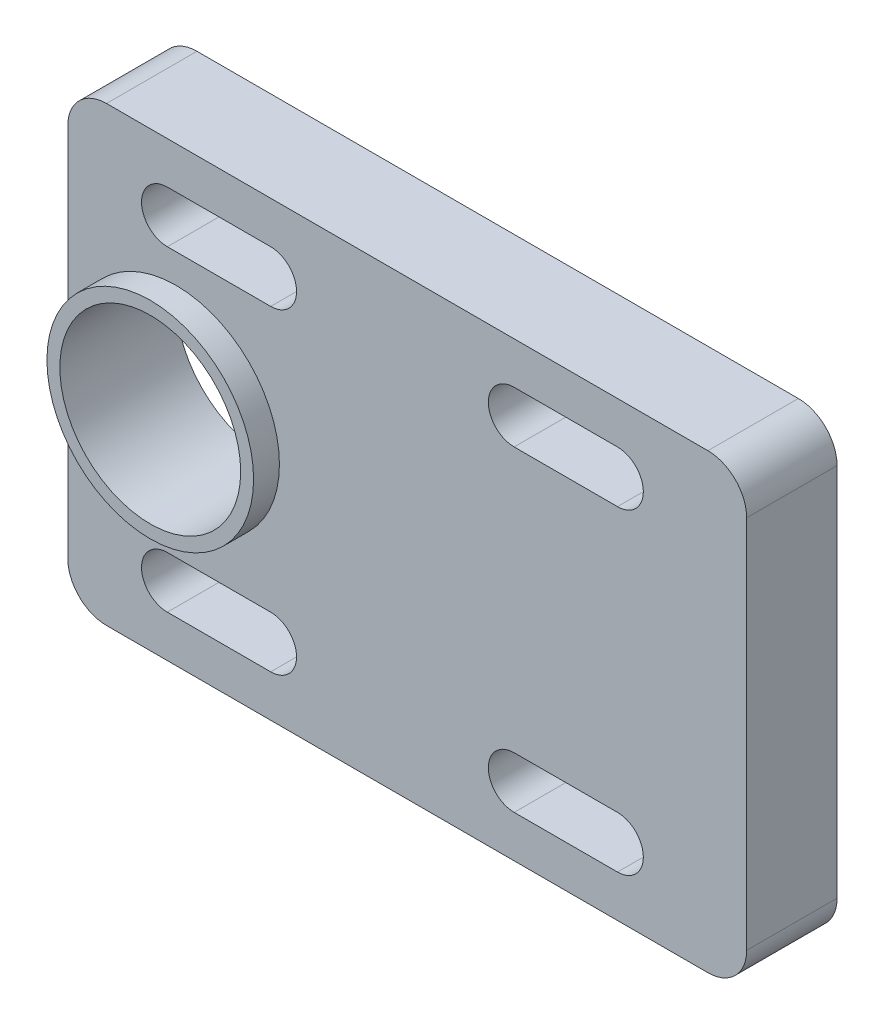
ISO-10303-21;
HEADER;
FILE_DESCRIPTION(('STEP AP214'),'2;1');
FILE_NAME('part.step','',(''),(''),'','','');
FILE_SCHEMA(('AUTOMOTIVE_DESIGN { 1 0 10303 214 1 1 1 1 }'));
ENDSEC;
DATA;
#1=APPLICATION_CONTEXT('core data for automotive mechanical design processes');
#2=APPLICATION_PROTOCOL_DEFINITION('international standard','automotive_design',2000,#1);
#3=PRODUCT_CONTEXT('',#1,'mechanical');
#4=PRODUCT('Part','Part','',(#3));
#5=PRODUCT_RELATED_PRODUCT_CATEGORY('part','',(#4));
#6=PRODUCT_DEFINITION_FORMATION('','',#4);
#7=PRODUCT_DEFINITION_CONTEXT('part definition',#1,'design');
#8=PRODUCT_DEFINITION('design','',#6,#7);
#9=PRODUCT_DEFINITION_SHAPE('','',#8);
#10=(LENGTH_UNIT() NAMED_UNIT(*) SI_UNIT(.MILLI.,.METRE.));
#11=(NAMED_UNIT(*) PLANE_ANGLE_UNIT() SI_UNIT($,.RADIAN.));
#12=(NAMED_UNIT(*) SI_UNIT($,.STERADIAN.) SOLID_ANGLE_UNIT());
#13=UNCERTAINTY_MEASURE_WITH_UNIT(LENGTH_MEASURE(1.E-05),#10,'distance_accuracy_value','');
#14=(GEOMETRIC_REPRESENTATION_CONTEXT(3) GLOBAL_UNCERTAINTY_ASSIGNED_CONTEXT((#13)) GLOBAL_UNIT_ASSIGNED_CONTEXT((#10,
#11,#12)) REPRESENTATION_CONTEXT('',''));
#15=CARTESIAN_POINT('',(0.,0.,0.));
#16=DIRECTION('',(0.,0.,1.));
#17=DIRECTION('',(1.,0.,0.));
#18=AXIS2_PLACEMENT_3D('',#15,#16,#17);
#19=CARTESIAN_POINT('',(-159.52130484111,-12.2499999999999,9.));
#20=DIRECTION('',(0.,0.,-1.));
#21=DIRECTION('',(-1.,0.,0.));
#22=AXIS2_PLACEMENT_3D('',#19,#20,#21);
#23=CYLINDRICAL_SURFACE('',#22,1.99999999999997);
#24=DIRECTION('',(0.,0.,-1.));
#25=VECTOR('',#24,1.);
#26=CARTESIAN_POINT('',(-159.52130484111,-10.2500000000001,9.));
#27=LINE('',#26,#25);
#28=CARTESIAN_POINT('',(-159.52130484111,-10.2500000000001,7.));
#29=VERTEX_POINT('',#28);
#30=CARTESIAN_POINT('',(-159.52130484111,-10.2500000000001,0.));
#31=VERTEX_POINT('',#30);
#32=EDGE_CURVE('E11',#29,#31,#27,.T.);
#33=ORIENTED_EDGE('',*,*,#32,.F.);
#34=CARTESIAN_POINT('',(-159.52130484111,-12.2499999999999,7.));
#35=DIRECTION('',(0.,0.,1.));
#36=DIRECTION('',(1.,0.,0.));
#37=AXIS2_PLACEMENT_3D('',#34,#35,#36);
#38=CIRCLE('',#37,1.99999999999997);
#39=CARTESIAN_POINT('',(-159.52130484111,-14.2500000000001,7.));
#40=VERTEX_POINT('',#39);
#41=EDGE_CURVE('E414',#40,#29,#38,.F.);
#42=ORIENTED_EDGE('',*,*,#41,.F.);
#43=DIRECTION('',(0.,0.,-1.));
#44=VECTOR('',#43,1.);
#45=CARTESIAN_POINT('',(-159.52130484111,-14.2500000000001,9.));
#46=LINE('',#45,#44);
#47=CARTESIAN_POINT('',(-159.52130484111,-14.2500000000001,0.));
#48=VERTEX_POINT('',#47);
#49=EDGE_CURVE('E306',#40,#48,#46,.T.);
#50=ORIENTED_EDGE('',*,*,#49,.T.);
#51=CARTESIAN_POINT('',(-159.52130484111,-12.2499999999999,0.));
#52=DIRECTION('',(0.,0.,1.));
#53=DIRECTION('',(1.,0.,0.));
#54=AXIS2_PLACEMENT_3D('',#51,#52,#53);
#55=CIRCLE('',#54,1.99999999999997);
#56=EDGE_CURVE('E338',#31,#48,#55,.T.);
#57=ORIENTED_EDGE('',*,*,#56,.F.);
#58=EDGE_LOOP('',(#33,#42,#50,#57));
#59=FACE_BOUND('',#58,.T.);
#60=ADVANCED_FACE('F39',(#59),#23,.F.);
#61=CARTESIAN_POINT('',(0.,-10.2500000000001,9.));
#62=DIRECTION('',(0.,-1.,0.));
#63=DIRECTION('',(1.,0.,0.));
#64=AXIS2_PLACEMENT_3D('',#61,#62,#63);
#65=PLANE('',#64);
#66=DIRECTION('',(0.,0.,-1.));
#67=VECTOR('',#66,1.);
#68=CARTESIAN_POINT('',(-151.52130484111,-10.2500000000001,9.));
#69=LINE('',#68,#67);
#70=CARTESIAN_POINT('',(-151.52130484111,-10.2500000000001,7.));
#71=VERTEX_POINT('',#70);
#72=CARTESIAN_POINT('',(-151.52130484111,-10.2500000000001,0.));
#73=VERTEX_POINT('',#72);
#74=EDGE_CURVE('E48',#71,#73,#69,.T.);
#75=ORIENTED_EDGE('',*,*,#74,.F.);
#76=DIRECTION('',(1.,0.,0.));
#77=VECTOR('',#76,1.);
#78=CARTESIAN_POINT('',(0.,-10.2500000000001,7.));
#79=LINE('',#78,#77);
#80=EDGE_CURVE('E412',#29,#71,#79,.T.);
#81=ORIENTED_EDGE('',*,*,#80,.F.);
#82=ORIENTED_EDGE('',*,*,#32,.T.);
#83=DIRECTION('',(-1.,0.,0.));
#84=VECTOR('',#83,1.);
#85=CARTESIAN_POINT('',(0.,-10.2500000000001,0.));
#86=LINE('',#85,#84);
#87=EDGE_CURVE('E333',#73,#31,#86,.T.);
#88=ORIENTED_EDGE('',*,*,#87,.F.);
#89=EDGE_LOOP('',(#75,#81,#82,#88));
#90=FACE_BOUND('',#89,.T.);
#91=ADVANCED_FACE('F334',(#90),#65,.T.);
#92=CARTESIAN_POINT('',(-151.52130484111,-12.2500000000001,9.));
#93=DIRECTION('',(0.,0.,-1.));
#94=DIRECTION('',(-1.,0.,0.));
#95=AXIS2_PLACEMENT_3D('',#92,#93,#94);
#96=CYLINDRICAL_SURFACE('',#95,1.99999999999997);
#97=DIRECTION('',(0.,0.,-1.));
#98=VECTOR('',#97,1.);
#99=CARTESIAN_POINT('',(-151.52130484111,-14.2500000000001,9.));
#100=LINE('',#99,#98);
#101=CARTESIAN_POINT('',(-151.52130484111,-14.2500000000001,7.));
#102=VERTEX_POINT('',#101);
#103=CARTESIAN_POINT('',(-151.52130484111,-14.2500000000001,0.));
#104=VERTEX_POINT('',#103);
#105=EDGE_CURVE('E310',#102,#104,#100,.T.);
#106=ORIENTED_EDGE('',*,*,#105,.F.);
#107=CARTESIAN_POINT('',(-151.52130484111,-12.2500000000001,7.));
#108=DIRECTION('',(0.,0.,1.));
#109=DIRECTION('',(1.,0.,0.));
#110=AXIS2_PLACEMENT_3D('',#107,#108,#109);
#111=CIRCLE('',#110,1.99999999999997);
#112=EDGE_CURVE('E329',#71,#102,#111,.F.);
#113=ORIENTED_EDGE('',*,*,#112,.F.);
#114=ORIENTED_EDGE('',*,*,#74,.T.);
#115=CARTESIAN_POINT('',(-151.52130484111,-12.2500000000001,0.));
#116=DIRECTION('',(0.,0.,1.));
#117=DIRECTION('',(1.,0.,0.));
#118=AXIS2_PLACEMENT_3D('',#115,#116,#117);
#119=CIRCLE('',#118,1.99999999999997);
#120=EDGE_CURVE('E328',#104,#73,#119,.T.);
#121=ORIENTED_EDGE('',*,*,#120,.F.);
#122=EDGE_LOOP('',(#106,#113,#114,#121));
#123=FACE_BOUND('',#122,.T.);
#124=ADVANCED_FACE('F326',(#123),#96,.F.);
#125=CARTESIAN_POINT('',(-159.52130484111,12.2499999999999,9.));
#126=DIRECTION('',(0.,0.,-1.));
#127=DIRECTION('',(-1.,0.,0.));
#128=AXIS2_PLACEMENT_3D('',#125,#126,#127);
#129=CYLINDRICAL_SURFACE('',#128,1.99999999999997);
#130=DIRECTION('',(0.,0.,-1.));
#131=VECTOR('',#130,1.);
#132=CARTESIAN_POINT('',(-159.52130484111,14.25,9.));
#133=LINE('',#132,#131);
#134=CARTESIAN_POINT('',(-159.52130484111,14.25,7.));
#135=VERTEX_POINT('',#134);
#136=CARTESIAN_POINT('',(-159.52130484111,14.25,0.));
#137=VERTEX_POINT('',#136);
#138=EDGE_CURVE('E273',#135,#137,#133,.T.);
#139=ORIENTED_EDGE('',*,*,#138,.F.);
#140=CARTESIAN_POINT('',(-159.52130484111,12.2499999999999,7.));
#141=DIRECTION('',(0.,0.,1.));
#142=DIRECTION('',(1.,0.,0.));
#143=AXIS2_PLACEMENT_3D('',#140,#141,#142);
#144=CIRCLE('',#143,1.99999999999997);
#145=CARTESIAN_POINT('',(-159.52130484111,10.2500000000001,7.));
#146=VERTEX_POINT('',#145);
#147=EDGE_CURVE('E407',#146,#135,#144,.F.);
#148=ORIENTED_EDGE('',*,*,#147,.F.);
#149=DIRECTION('',(0.,0.,-1.));
#150=VECTOR('',#149,1.);
#151=CARTESIAN_POINT('',(-159.52130484111,10.2500000000001,9.));
#152=LINE('',#151,#150);
#153=CARTESIAN_POINT('',(-159.52130484111,10.2500000000001,0.));
#154=VERTEX_POINT('',#153);
#155=EDGE_CURVE('E288',#146,#154,#152,.T.);
#156=ORIENTED_EDGE('',*,*,#155,.T.);
#157=CARTESIAN_POINT('',(-159.52130484111,12.2499999999999,0.));
#158=DIRECTION('',(0.,0.,1.));
#159=DIRECTION('',(1.,0.,0.));
#160=AXIS2_PLACEMENT_3D('',#157,#158,#159);
#161=CIRCLE('',#160,1.99999999999997);
#162=EDGE_CURVE('E352',#137,#154,#161,.T.);
#163=ORIENTED_EDGE('',*,*,#162,.F.);
#164=EDGE_LOOP('',(#139,#148,#156,#163));
#165=FACE_BOUND('',#164,.T.);
#166=ADVANCED_FACE('F476',(#165),#129,.F.);
#167=CARTESIAN_POINT('',(0.,14.25,9.));
#168=DIRECTION('',(0.,-1.,0.));
#169=DIRECTION('',(0.,0.,-1.));
#170=AXIS2_PLACEMENT_3D('',#167,#168,#169);
#171=PLANE('',#170);
#172=DIRECTION('',(0.,0.,-1.));
#173=VECTOR('',#172,1.);
#174=CARTESIAN_POINT('',(-151.52130484111,14.25,9.));
#175=LINE('',#174,#173);
#176=CARTESIAN_POINT('',(-151.52130484111,14.25,7.));
#177=VERTEX_POINT('',#176);
#178=CARTESIAN_POINT('',(-151.52130484111,14.25,0.));
#179=VERTEX_POINT('',#178);
#180=EDGE_CURVE('E299',#177,#179,#175,.T.);
#181=ORIENTED_EDGE('',*,*,#180,.F.);
#182=DIRECTION('',(1.,0.,0.));
#183=VECTOR('',#182,1.);
#184=CARTESIAN_POINT('',(0.,14.25,7.));
#185=LINE('',#184,#183);
#186=EDGE_CURVE('E405',#135,#177,#185,.T.);
#187=ORIENTED_EDGE('',*,*,#186,.F.);
#188=ORIENTED_EDGE('',*,*,#138,.T.);
#189=DIRECTION('',(-1.,0.,0.));
#190=VECTOR('',#189,1.);
#191=CARTESIAN_POINT('',(0.,14.25,0.));
#192=LINE('',#191,#190);
#193=EDGE_CURVE('E349',#179,#137,#192,.T.);
#194=ORIENTED_EDGE('',*,*,#193,.F.);
#195=EDGE_LOOP('',(#181,#187,#188,#194));
#196=FACE_BOUND('',#195,.T.);
#197=ADVANCED_FACE('F473',(#196),#171,.T.);
#198=CARTESIAN_POINT('',(-151.52130484111,12.25,9.));
#199=DIRECTION('',(0.,0.,-1.));
#200=DIRECTION('',(-1.,0.,0.));
#201=AXIS2_PLACEMENT_3D('',#198,#199,#200);
#202=CYLINDRICAL_SURFACE('',#201,1.99999999999997);
#203=DIRECTION('',(0.,0.,-1.));
#204=VECTOR('',#203,1.);
#205=CARTESIAN_POINT('',(-151.52130484111,10.2500000000001,9.));
#206=LINE('',#205,#204);
#207=CARTESIAN_POINT('',(-151.52130484111,10.2500000000001,7.));
#208=VERTEX_POINT('',#207);
#209=CARTESIAN_POINT('',(-151.52130484111,10.2500000000001,0.));
#210=VERTEX_POINT('',#209);
#211=EDGE_CURVE('E292',#208,#210,#206,.T.);
#212=ORIENTED_EDGE('',*,*,#211,.F.);
#213=CARTESIAN_POINT('',(-151.52130484111,12.25,7.));
#214=DIRECTION('',(0.,0.,1.));
#215=DIRECTION('',(1.,0.,0.));
#216=AXIS2_PLACEMENT_3D('',#213,#214,#215);
#217=CIRCLE('',#216,1.99999999999997);
#218=EDGE_CURVE('E56',#177,#208,#217,.F.);
#219=ORIENTED_EDGE('',*,*,#218,.F.);
#220=ORIENTED_EDGE('',*,*,#180,.T.);
#221=CARTESIAN_POINT('',(-151.52130484111,12.25,0.));
#222=DIRECTION('',(0.,0.,1.));
#223=DIRECTION('',(1.,0.,0.));
#224=AXIS2_PLACEMENT_3D('',#221,#222,#223);
#225=CIRCLE('',#224,1.99999999999997);
#226=EDGE_CURVE('E346',#210,#179,#225,.T.);
#227=ORIENTED_EDGE('',*,*,#226,.F.);
#228=EDGE_LOOP('',(#212,#219,#220,#227));
#229=FACE_BOUND('',#228,.T.);
#230=ADVANCED_FACE('F469',(#229),#202,.F.);
#231=CARTESIAN_POINT('',(-144.52130484111,14.5,9.));
#232=DIRECTION('',(0.,0.,-1.));
#233=DIRECTION('',(-1.,0.,0.));
#234=AXIS2_PLACEMENT_3D('',#231,#232,#233);
#235=CYLINDRICAL_SURFACE('',#234,2.99999999999999);
#236=DIRECTION('',(0.,0.,-1.));
#237=VECTOR('',#236,1.);
#238=CARTESIAN_POINT('',(-144.52130484111,17.5,9.));
#239=LINE('',#238,#237);
#240=CARTESIAN_POINT('',(-144.52130484111,17.5,7.));
#241=VERTEX_POINT('',#240);
#242=CARTESIAN_POINT('',(-144.52130484111,17.5,0.));
#243=VERTEX_POINT('',#242);
#244=EDGE_CURVE('E252',#241,#243,#239,.T.);
#245=ORIENTED_EDGE('',*,*,#244,.F.);
#246=CARTESIAN_POINT('',(-144.52130484111,14.5,7.));
#247=DIRECTION('',(0.,0.,1.));
#248=DIRECTION('',(1.,0.,0.));
#249=AXIS2_PLACEMENT_3D('',#246,#247,#248);
#250=CIRCLE('',#249,2.99999999999999);
#251=CARTESIAN_POINT('',(-141.52130484111,14.5,7.));
#252=VERTEX_POINT('',#251);
#253=EDGE_CURVE('E429',#252,#241,#250,.T.);
#254=ORIENTED_EDGE('',*,*,#253,.F.);
#255=DIRECTION('',(0.,0.,-1.));
#256=VECTOR('',#255,1.);
#257=CARTESIAN_POINT('',(-141.52130484111,14.5,9.));
#258=LINE('',#257,#256);
#259=CARTESIAN_POINT('',(-141.52130484111,14.5,0.));
#260=VERTEX_POINT('',#259);
#261=EDGE_CURVE('E259',#252,#260,#258,.T.);
#262=ORIENTED_EDGE('',*,*,#261,.T.);
#263=CARTESIAN_POINT('',(-144.52130484111,14.5,0.));
#264=DIRECTION('',(0.,0.,1.));
#265=DIRECTION('',(1.,0.,0.));
#266=AXIS2_PLACEMENT_3D('',#263,#264,#265);
#267=CIRCLE('',#266,2.99999999999999);
#268=EDGE_CURVE('E375',#243,#260,#267,.F.);
#269=ORIENTED_EDGE('',*,*,#268,.F.);
#270=EDGE_LOOP('',(#245,#254,#262,#269));
#271=FACE_BOUND('',#270,.T.);
#272=ADVANCED_FACE('F472',(#271),#235,.T.);
#273=CARTESIAN_POINT('',(0.,17.5,9.));
#274=DIRECTION('',(0.,1.,0.));
#275=DIRECTION('',(-1.,0.,0.));
#276=AXIS2_PLACEMENT_3D('',#273,#274,#275);
#277=PLANE('',#276);
#278=DIRECTION('',(0.,0.,-1.));
#279=VECTOR('',#278,1.);
#280=CARTESIAN_POINT('',(-191.078194944525,17.5,9.));
#281=LINE('',#280,#279);
#282=CARTESIAN_POINT('',(-191.078194944525,17.5,7.));
#283=VERTEX_POINT('',#282);
#284=CARTESIAN_POINT('',(-191.078194944525,17.5,0.));
#285=VERTEX_POINT('',#284);
#286=EDGE_CURVE('E282',#283,#285,#281,.T.);
#287=ORIENTED_EDGE('',*,*,#286,.F.);
#288=DIRECTION('',(-1.,0.,0.));
#289=VECTOR('',#288,1.);
#290=CARTESIAN_POINT('',(0.,17.5,7.));
#291=LINE('',#290,#289);
#292=EDGE_CURVE('E427',#241,#283,#291,.T.);
#293=ORIENTED_EDGE('',*,*,#292,.F.);
#294=ORIENTED_EDGE('',*,*,#244,.T.);
#295=DIRECTION('',(1.,0.,0.));
#296=VECTOR('',#295,1.);
#297=CARTESIAN_POINT('',(0.,17.5,0.));
#298=LINE('',#297,#296);
#299=EDGE_CURVE('E372',#285,#243,#298,.T.);
#300=ORIENTED_EDGE('',*,*,#299,.F.);
#301=EDGE_LOOP('',(#287,#293,#294,#300));
#302=FACE_BOUND('',#301,.T.);
#303=ADVANCED_FACE('F503',(#302),#277,.T.);
#304=CARTESIAN_POINT('',(-191.078194944525,14.5,9.));
#305=DIRECTION('',(0.,0.,-1.));
#306=DIRECTION('',(-1.,0.,0.));
#307=AXIS2_PLACEMENT_3D('',#304,#305,#306);
#308=CYLINDRICAL_SURFACE('',#307,3.);
#309=DIRECTION('',(0.,0.,-1.));
#310=VECTOR('',#309,1.);
#311=CARTESIAN_POINT('',(-194.078194944525,14.5,9.));
#312=LINE('',#311,#310);
#313=CARTESIAN_POINT('',(-194.078194944525,14.5,7.));
#314=VERTEX_POINT('',#313);
#315=CARTESIAN_POINT('',(-194.078194944525,14.5,0.));
#316=VERTEX_POINT('',#315);
#317=EDGE_CURVE('E281',#314,#316,#312,.T.);
#318=ORIENTED_EDGE('',*,*,#317,.F.);
#319=CARTESIAN_POINT('',(-191.078194944525,14.5,7.));
#320=DIRECTION('',(0.,0.,1.));
#321=DIRECTION('',(1.,0.,0.));
#322=AXIS2_PLACEMENT_3D('',#319,#320,#321);
#323=CIRCLE('',#322,3.);
#324=EDGE_CURVE('E425',#283,#314,#323,.T.);
#325=ORIENTED_EDGE('',*,*,#324,.F.);
#326=ORIENTED_EDGE('',*,*,#286,.T.);
#327=CARTESIAN_POINT('',(-191.078194944525,14.5,0.));
#328=DIRECTION('',(0.,0.,1.));
#329=DIRECTION('',(1.,0.,0.));
#330=AXIS2_PLACEMENT_3D('',#327,#328,#329);
#331=CIRCLE('',#330,3.);
#332=EDGE_CURVE('E369',#316,#285,#331,.F.);
#333=ORIENTED_EDGE('',*,*,#332,.F.);
#334=EDGE_LOOP('',(#318,#325,#326,#333));
#335=FACE_BOUND('',#334,.T.);
#336=ADVANCED_FACE('F499',(#335),#308,.T.);
#337=CARTESIAN_POINT('',(-194.078194944525,0.,9.));
#338=DIRECTION('',(-1.,0.,0.));
#339=DIRECTION('',(0.,0.,1.));
#340=AXIS2_PLACEMENT_3D('',#337,#338,#339);
#341=PLANE('',#340);
#342=DIRECTION('',(0.,0.,-1.));
#343=VECTOR('',#342,1.);
#344=CARTESIAN_POINT('',(-194.078194944525,-14.5,9.));
#345=LINE('',#344,#343);
#346=CARTESIAN_POINT('',(-194.078194944525,-14.5,7.));
#347=VERTEX_POINT('',#346);
#348=CARTESIAN_POINT('',(-194.078194944525,-14.5,0.));
#349=VERTEX_POINT('',#348);
#350=EDGE_CURVE('E279',#347,#349,#345,.T.);
#351=ORIENTED_EDGE('',*,*,#350,.F.);
#352=DIRECTION('',(0.,-1.,0.));
#353=VECTOR('',#352,1.);
#354=CARTESIAN_POINT('',(-194.078194944525,0.,7.));
#355=LINE('',#354,#353);
#356=EDGE_CURVE('E423',#314,#347,#355,.T.);
#357=ORIENTED_EDGE('',*,*,#356,.F.);
#358=ORIENTED_EDGE('',*,*,#317,.T.);
#359=DIRECTION('',(0.,1.,0.));
#360=VECTOR('',#359,1.);
#361=CARTESIAN_POINT('',(-194.078194944525,0.,0.));
#362=LINE('',#361,#360);
#363=EDGE_CURVE('E366',#349,#316,#362,.T.);
#364=ORIENTED_EDGE('',*,*,#363,.F.);
#365=EDGE_LOOP('',(#351,#357,#358,#364));
#366=FACE_BOUND('',#365,.T.);
#367=ADVANCED_FACE('F495',(#366),#341,.T.);
#368=CARTESIAN_POINT('',(-191.078194944525,-14.5,9.));
#369=DIRECTION('',(0.,0.,-1.));
#370=DIRECTION('',(-1.,0.,0.));
#371=AXIS2_PLACEMENT_3D('',#368,#369,#370);
#372=CYLINDRICAL_SURFACE('',#371,3.);
#373=DIRECTION('',(0.,0.,-1.));
#374=VECTOR('',#373,1.);
#375=CARTESIAN_POINT('',(-191.078194944525,-17.5,9.));
#376=LINE('',#375,#374);
#377=CARTESIAN_POINT('',(-191.078194944525,-17.5,7.));
#378=VERTEX_POINT('',#377);
#379=CARTESIAN_POINT('',(-191.078194944525,-17.5,0.));
#380=VERTEX_POINT('',#379);
#381=EDGE_CURVE('E277',#378,#380,#376,.T.);
#382=ORIENTED_EDGE('',*,*,#381,.F.);
#383=CARTESIAN_POINT('',(-191.078194944525,-14.5,7.));
#384=DIRECTION('',(0.,0.,1.));
#385=DIRECTION('',(1.,0.,0.));
#386=AXIS2_PLACEMENT_3D('',#383,#384,#385);
#387=CIRCLE('',#386,3.);
#388=EDGE_CURVE('E421',#347,#378,#387,.T.);
#389=ORIENTED_EDGE('',*,*,#388,.F.);
#390=ORIENTED_EDGE('',*,*,#350,.T.);
#391=CARTESIAN_POINT('',(-191.078194944525,-14.5,0.));
#392=DIRECTION('',(0.,0.,1.));
#393=DIRECTION('',(1.,0.,0.));
#394=AXIS2_PLACEMENT_3D('',#391,#392,#393);
#395=CIRCLE('',#394,3.);
#396=EDGE_CURVE('E363',#380,#349,#395,.F.);
#397=ORIENTED_EDGE('',*,*,#396,.F.);
#398=EDGE_LOOP('',(#382,#389,#390,#397));
#399=FACE_BOUND('',#398,.T.);
#400=ADVANCED_FACE('F491',(#399),#372,.T.);
#401=CARTESIAN_POINT('',(0.,-17.5,9.));
#402=DIRECTION('',(0.,1.,0.));
#403=DIRECTION('',(-1.,0.,0.));
#404=AXIS2_PLACEMENT_3D('',#401,#402,#403);
#405=PLANE('',#404);
#406=DIRECTION('',(1.,0.,0.));
#407=VECTOR('',#406,1.);
#408=CARTESIAN_POINT('',(0.,-17.5,7.));
#409=LINE('',#408,#407);
#410=CARTESIAN_POINT('',(-144.52130484111,-17.5,7.));
#411=VERTEX_POINT('',#410);
#412=EDGE_CURVE('E419',#378,#411,#409,.T.);
#413=ORIENTED_EDGE('',*,*,#412,.F.);
#414=ORIENTED_EDGE('',*,*,#381,.T.);
#415=DIRECTION('',(1.,0.,0.));
#416=VECTOR('',#415,1.);
#417=CARTESIAN_POINT('',(0.,-17.5,0.));
#418=LINE('',#417,#416);
#419=CARTESIAN_POINT('',(-144.52130484111,-17.5,0.));
#420=VERTEX_POINT('',#419);
#421=EDGE_CURVE('E360',#380,#420,#418,.T.);
#422=ORIENTED_EDGE('',*,*,#421,.T.);
#423=DIRECTION('',(0.,0.,-1.));
#424=VECTOR('',#423,1.);
#425=CARTESIAN_POINT('',(-144.52130484111,-17.5,9.));
#426=LINE('',#425,#424);
#427=EDGE_CURVE('E270',#411,#420,#426,.T.);
#428=ORIENTED_EDGE('',*,*,#427,.F.);
#429=EDGE_LOOP('',(#413,#414,#422,#428));
#430=FACE_BOUND('',#429,.T.);
#431=ADVANCED_FACE('F487',(#430),#405,.F.);
#432=CARTESIAN_POINT('',(-144.52130484111,-14.5,9.));
#433=DIRECTION('',(0.,0.,-1.));
#434=DIRECTION('',(-1.,0.,0.));
#435=AXIS2_PLACEMENT_3D('',#432,#433,#434);
#436=CYLINDRICAL_SURFACE('',#435,2.99999999999999);
#437=CARTESIAN_POINT('',(-144.52130484111,-14.5,7.));
#438=DIRECTION('',(0.,0.,1.));
#439=DIRECTION('',(1.,0.,0.));
#440=AXIS2_PLACEMENT_3D('',#437,#438,#439);
#441=CIRCLE('',#440,2.99999999999999);
#442=CARTESIAN_POINT('',(-141.52130484111,-14.5,7.));
#443=VERTEX_POINT('',#442);
#444=EDGE_CURVE('E64',#411,#443,#441,.T.);
#445=ORIENTED_EDGE('',*,*,#444,.F.);
#446=ORIENTED_EDGE('',*,*,#427,.T.);
#447=CARTESIAN_POINT('',(-144.52130484111,-14.5,0.));
#448=DIRECTION('',(0.,0.,1.));
#449=DIRECTION('',(1.,0.,0.));
#450=AXIS2_PLACEMENT_3D('',#447,#448,#449);
#451=CIRCLE('',#450,2.99999999999999);
#452=CARTESIAN_POINT('',(-141.52130484111,-14.5,0.));
#453=VERTEX_POINT('',#452);
#454=EDGE_CURVE('E357',#420,#453,#451,.T.);
#455=ORIENTED_EDGE('',*,*,#454,.T.);
#456=DIRECTION('',(0.,0.,-1.));
#457=VECTOR('',#456,1.);
#458=CARTESIAN_POINT('',(-141.52130484111,-14.5,9.));
#459=LINE('',#458,#457);
#460=EDGE_CURVE('E263',#443,#453,#459,.T.);
#461=ORIENTED_EDGE('',*,*,#460,.F.);
#462=EDGE_LOOP('',(#445,#446,#455,#461));
#463=FACE_BOUND('',#462,.T.);
#464=ADVANCED_FACE('F483',(#463),#436,.T.);
#465=CARTESIAN_POINT('',(-186.368092358427,12.2500000000001,9.));
#466=DIRECTION('',(0.,0.,-1.));
#467=DIRECTION('',(-1.,0.,0.));
#468=AXIS2_PLACEMENT_3D('',#465,#466,#467);
#469=CYLINDRICAL_SURFACE('',#468,2.);
#470=DIRECTION('',(0.,0.,-1.));
#471=VECTOR('',#470,1.);
#472=CARTESIAN_POINT('',(-186.368092358427,14.2500000000001,9.));
#473=LINE('',#472,#471);
#474=CARTESIAN_POINT('',(-186.368092358427,14.2500000000001,7.));
#475=VERTEX_POINT('',#474);
#476=CARTESIAN_POINT('',(-186.368092358427,14.2500000000001,0.));
#477=VERTEX_POINT('',#476);
#478=EDGE_CURVE('E234',#475,#477,#473,.T.);
#479=ORIENTED_EDGE('',*,*,#478,.F.);
#480=CARTESIAN_POINT('',(-186.368092358427,12.2500000000001,7.));
#481=DIRECTION('',(0.,0.,1.));
#482=DIRECTION('',(1.,0.,0.));
#483=AXIS2_PLACEMENT_3D('',#480,#481,#482);
#484=CIRCLE('',#483,2.);
#485=CARTESIAN_POINT('',(-186.368092358427,10.2500000000001,7.));
#486=VERTEX_POINT('',#485);
#487=EDGE_CURVE('E437',#486,#475,#484,.F.);
#488=ORIENTED_EDGE('',*,*,#487,.F.);
#489=DIRECTION('',(0.,0.,-1.));
#490=VECTOR('',#489,1.);
#491=CARTESIAN_POINT('',(-186.368092358427,10.2500000000001,9.));
#492=LINE('',#491,#490);
#493=CARTESIAN_POINT('',(-186.368092358427,10.2500000000001,0.));
#494=VERTEX_POINT('',#493);
#495=EDGE_CURVE('E240',#486,#494,#492,.T.);
#496=ORIENTED_EDGE('',*,*,#495,.T.);
#497=CARTESIAN_POINT('',(-186.368092358427,12.2500000000001,0.));
#498=DIRECTION('',(0.,0.,1.));
#499=DIRECTION('',(1.,0.,0.));
#500=AXIS2_PLACEMENT_3D('',#497,#498,#499);
#501=CIRCLE('',#500,2.);
#502=EDGE_CURVE('E386',#477,#494,#501,.T.);
#503=ORIENTED_EDGE('',*,*,#502,.F.);
#504=EDGE_LOOP('',(#479,#488,#496,#503));
#505=FACE_BOUND('',#504,.T.);
#506=ADVANCED_FACE('F486',(#505),#469,.F.);
#507=CARTESIAN_POINT('',(0.,14.2500000000001,9.));
#508=DIRECTION('',(0.,-1.,0.));
#509=DIRECTION('',(0.,0.,-1.));
#510=AXIS2_PLACEMENT_3D('',#507,#508,#509);
#511=PLANE('',#510);
#512=DIRECTION('',(0.,0.,-1.));
#513=VECTOR('',#512,1.);
#514=CARTESIAN_POINT('',(-178.368092358427,14.2500000000001,9.));
#515=LINE('',#514,#513);
#516=CARTESIAN_POINT('',(-178.368092358427,14.2500000000001,7.));
#517=VERTEX_POINT('',#516);
#518=CARTESIAN_POINT('',(-178.368092358427,14.2500000000001,0.));
#519=VERTEX_POINT('',#518);
#520=EDGE_CURVE('E249',#517,#519,#515,.T.);
#521=ORIENTED_EDGE('',*,*,#520,.F.);
#522=DIRECTION('',(1.,0.,0.));
#523=VECTOR('',#522,1.);
#524=CARTESIAN_POINT('',(0.,14.2500000000001,7.));
#525=LINE('',#524,#523);
#526=EDGE_CURVE('E435',#475,#517,#525,.T.);
#527=ORIENTED_EDGE('',*,*,#526,.F.);
#528=ORIENTED_EDGE('',*,*,#478,.T.);
#529=DIRECTION('',(-1.,0.,0.));
#530=VECTOR('',#529,1.);
#531=CARTESIAN_POINT('',(0.,14.2500000000001,0.));
#532=LINE('',#531,#530);
#533=EDGE_CURVE('E383',#519,#477,#532,.T.);
#534=ORIENTED_EDGE('',*,*,#533,.F.);
#535=EDGE_LOOP('',(#521,#527,#528,#534));
#536=FACE_BOUND('',#535,.T.);
#537=ADVANCED_FACE('F514',(#536),#511,.T.);
#538=CARTESIAN_POINT('',(-178.368092358427,12.2500000000001,9.));
#539=DIRECTION('',(0.,0.,-1.));
#540=DIRECTION('',(-1.,0.,0.));
#541=AXIS2_PLACEMENT_3D('',#538,#539,#540);
#542=CYLINDRICAL_SURFACE('',#541,2.);
#543=DIRECTION('',(0.,0.,-1.));
#544=VECTOR('',#543,1.);
#545=CARTESIAN_POINT('',(-178.368092358427,10.2500000000001,9.));
#546=LINE('',#545,#544);
#547=CARTESIAN_POINT('',(-178.368092358427,10.2500000000001,7.));
#548=VERTEX_POINT('',#547);
#549=CARTESIAN_POINT('',(-178.368092358427,10.2500000000001,0.));
#550=VERTEX_POINT('',#549);
#551=EDGE_CURVE('E242',#548,#550,#546,.T.);
#552=ORIENTED_EDGE('',*,*,#551,.F.);
#553=CARTESIAN_POINT('',(-178.368092358427,12.2500000000001,7.));
#554=DIRECTION('',(0.,0.,1.));
#555=DIRECTION('',(1.,0.,0.));
#556=AXIS2_PLACEMENT_3D('',#553,#554,#555);
#557=CIRCLE('',#556,2.);
#558=EDGE_CURVE('E433',#517,#548,#557,.F.);
#559=ORIENTED_EDGE('',*,*,#558,.F.);
#560=ORIENTED_EDGE('',*,*,#520,.T.);
#561=CARTESIAN_POINT('',(-178.368092358427,12.2500000000001,0.));
#562=DIRECTION('',(0.,0.,1.));
#563=DIRECTION('',(1.,0.,0.));
#564=AXIS2_PLACEMENT_3D('',#561,#562,#563);
#565=CIRCLE('',#564,2.);
#566=EDGE_CURVE('E380',#550,#519,#565,.T.);
#567=ORIENTED_EDGE('',*,*,#566,.F.);
#568=EDGE_LOOP('',(#552,#559,#560,#567));
#569=FACE_BOUND('',#568,.T.);
#570=ADVANCED_FACE('F511',(#569),#542,.F.);
#571=CARTESIAN_POINT('',(-186.368092358427,-12.2500000000001,9.));
#572=DIRECTION('',(0.,0.,-1.));
#573=DIRECTION('',(-1.,0.,0.));
#574=AXIS2_PLACEMENT_3D('',#571,#572,#573);
#575=CYLINDRICAL_SURFACE('',#574,2.);
#576=DIRECTION('',(0.,0.,-1.));
#577=VECTOR('',#576,1.);
#578=CARTESIAN_POINT('',(-186.368092358427,-10.2500000000001,9.));
#579=LINE('',#578,#577);
#580=CARTESIAN_POINT('',(-186.368092358427,-10.2500000000001,7.));
#581=VERTEX_POINT('',#580);
#582=CARTESIAN_POINT('',(-186.368092358427,-10.2500000000001,0.));
#583=VERTEX_POINT('',#582);
#584=EDGE_CURVE('E43',#581,#583,#579,.T.);
#585=ORIENTED_EDGE('',*,*,#584,.F.);
#586=CARTESIAN_POINT('',(-186.368092358427,-12.2500000000001,7.));
#587=DIRECTION('',(0.,0.,1.));
#588=DIRECTION('',(1.,0.,0.));
#589=AXIS2_PLACEMENT_3D('',#586,#587,#588);
#590=CIRCLE('',#589,2.);
#591=CARTESIAN_POINT('',(-186.368092358427,-14.2500000000001,7.));
#592=VERTEX_POINT('',#591);
#593=EDGE_CURVE('E204',#592,#581,#590,.F.);
#594=ORIENTED_EDGE('',*,*,#593,.F.);
#595=DIRECTION('',(0.,0.,-1.));
#596=VECTOR('',#595,1.);
#597=CARTESIAN_POINT('',(-186.368092358427,-14.2500000000001,9.));
#598=LINE('',#597,#596);
#599=CARTESIAN_POINT('',(-186.368092358427,-14.2500000000001,0.));
#600=VERTEX_POINT('',#599);
#601=EDGE_CURVE('E217',#592,#600,#598,.T.);
#602=ORIENTED_EDGE('',*,*,#601,.T.);
#603=CARTESIAN_POINT('',(-186.368092358427,-12.2500000000001,0.));
#604=DIRECTION('',(0.,0.,1.));
#605=DIRECTION('',(1.,0.,0.));
#606=AXIS2_PLACEMENT_3D('',#603,#604,#605);
#607=CIRCLE('',#606,2.);
#608=EDGE_CURVE('E396',#583,#600,#607,.T.);
#609=ORIENTED_EDGE('',*,*,#608,.F.);
#610=EDGE_LOOP('',(#585,#594,#602,#609));
#611=FACE_BOUND('',#610,.T.);
#612=ADVANCED_FACE('F215',(#611),#575,.F.);
#613=CARTESIAN_POINT('',(0.,-10.2500000000001,9.));
#614=DIRECTION('',(0.,-1.,0.));
#615=DIRECTION('',(1.,0.,0.));
#616=AXIS2_PLACEMENT_3D('',#613,#614,#615);
#617=PLANE('',#616);
#618=DIRECTION('',(0.,0.,-1.));
#619=VECTOR('',#618,1.);
#620=CARTESIAN_POINT('',(-178.368092358427,-10.2500000000001,9.));
#621=LINE('',#620,#619);
#622=CARTESIAN_POINT('',(-178.368092358427,-10.2500000000001,7.));
#623=VERTEX_POINT('',#622);
#624=CARTESIAN_POINT('',(-178.368092358427,-10.2500000000001,0.));
#625=VERTEX_POINT('',#624);
#626=EDGE_CURVE('E228',#623,#625,#621,.T.);
#627=ORIENTED_EDGE('',*,*,#626,.F.);
#628=DIRECTION('',(1.,0.,0.));
#629=VECTOR('',#628,1.);
#630=CARTESIAN_POINT('',(0.,-10.2500000000001,7.));
#631=LINE('',#630,#629);
#632=EDGE_CURVE('E219',#581,#623,#631,.T.);
#633=ORIENTED_EDGE('',*,*,#632,.F.);
#634=ORIENTED_EDGE('',*,*,#584,.T.);
#635=DIRECTION('',(-1.,0.,0.));
#636=VECTOR('',#635,1.);
#637=CARTESIAN_POINT('',(0.,-10.2500000000001,0.));
#638=LINE('',#637,#636);
#639=EDGE_CURVE('E393',#625,#583,#638,.T.);
#640=ORIENTED_EDGE('',*,*,#639,.F.);
#641=EDGE_LOOP('',(#627,#633,#634,#640));
#642=FACE_BOUND('',#641,.T.);
#643=ADVANCED_FACE('F524',(#642),#617,.T.);
#644=CARTESIAN_POINT('',(-178.368092358427,-12.2500000000001,9.));
#645=DIRECTION('',(0.,0.,-1.));
#646=DIRECTION('',(-1.,0.,0.));
#647=AXIS2_PLACEMENT_3D('',#644,#645,#646);
#648=CYLINDRICAL_SURFACE('',#647,2.);
#649=DIRECTION('',(0.,0.,-1.));
#650=VECTOR('',#649,1.);
#651=CARTESIAN_POINT('',(-178.368092358427,-14.2500000000001,9.));
#652=LINE('',#651,#650);
#653=CARTESIAN_POINT('',(-178.368092358427,-14.2500000000001,7.));
#654=VERTEX_POINT('',#653);
#655=CARTESIAN_POINT('',(-178.368092358427,-14.2500000000001,0.));
#656=VERTEX_POINT('',#655);
#657=EDGE_CURVE('E225',#654,#656,#652,.T.);
#658=ORIENTED_EDGE('',*,*,#657,.F.);
#659=CARTESIAN_POINT('',(-178.368092358427,-12.2500000000001,7.));
#660=DIRECTION('',(0.,0.,1.));
#661=DIRECTION('',(1.,0.,0.));
#662=AXIS2_PLACEMENT_3D('',#659,#660,#661);
#663=CIRCLE('',#662,2.);
#664=EDGE_CURVE('E207',#623,#654,#663,.F.);
#665=ORIENTED_EDGE('',*,*,#664,.F.);
#666=ORIENTED_EDGE('',*,*,#626,.T.);
#667=CARTESIAN_POINT('',(-178.368092358427,-12.2500000000001,0.));
#668=DIRECTION('',(0.,0.,1.));
#669=DIRECTION('',(1.,0.,0.));
#670=AXIS2_PLACEMENT_3D('',#667,#668,#669);
#671=CIRCLE('',#670,2.);
#672=EDGE_CURVE('E390',#656,#625,#671,.T.);
#673=ORIENTED_EDGE('',*,*,#672,.F.);
#674=EDGE_LOOP('',(#658,#665,#666,#673));
#675=FACE_BOUND('',#674,.T.);
#676=ADVANCED_FACE('F467',(#675),#648,.F.);
#677=CARTESIAN_POINT('',(0.,10.2500000000001,9.));
#678=DIRECTION('',(0.,-1.,0.));
#679=DIRECTION('',(1.,0.,0.));
#680=AXIS2_PLACEMENT_3D('',#677,#678,#679);
#681=PLANE('',#680);
#682=DIRECTION('',(-1.,0.,0.));
#683=VECTOR('',#682,1.);
#684=CARTESIAN_POINT('',(0.,10.2500000000001,7.));
#685=LINE('',#684,#683);
#686=EDGE_CURVE('E409',#208,#146,#685,.T.);
#687=ORIENTED_EDGE('',*,*,#686,.F.);
#688=ORIENTED_EDGE('',*,*,#211,.T.);
#689=DIRECTION('',(-1.,0.,0.));
#690=VECTOR('',#689,1.);
#691=CARTESIAN_POINT('',(0.,10.2500000000001,0.));
#692=LINE('',#691,#690);
#693=EDGE_CURVE('E344',#210,#154,#692,.T.);
#694=ORIENTED_EDGE('',*,*,#693,.T.);
#695=ORIENTED_EDGE('',*,*,#155,.F.);
#696=EDGE_LOOP('',(#687,#688,#694,#695));
#697=FACE_BOUND('',#696,.T.);
#698=ADVANCED_FACE('F463',(#697),#681,.F.);
#699=CARTESIAN_POINT('',(-141.52130484111,0.,9.));
#700=DIRECTION('',(-1.,0.,0.));
#701=DIRECTION('',(0.,0.,1.));
#702=AXIS2_PLACEMENT_3D('',#699,#700,#701);
#703=PLANE('',#702);
#704=DIRECTION('',(0.,1.,0.));
#705=VECTOR('',#704,1.);
#706=CARTESIAN_POINT('',(-141.52130484111,0.,7.));
#707=LINE('',#706,#705);
#708=EDGE_CURVE('E431',#443,#252,#707,.T.);
#709=ORIENTED_EDGE('',*,*,#708,.F.);
#710=ORIENTED_EDGE('',*,*,#460,.T.);
#711=DIRECTION('',(0.,1.,0.));
#712=VECTOR('',#711,1.);
#713=CARTESIAN_POINT('',(-141.52130484111,0.,0.));
#714=LINE('',#713,#712);
#715=EDGE_CURVE('E355',#453,#260,#714,.T.);
#716=ORIENTED_EDGE('',*,*,#715,.T.);
#717=ORIENTED_EDGE('',*,*,#261,.F.);
#718=EDGE_LOOP('',(#709,#710,#716,#717));
#719=FACE_BOUND('',#718,.T.);
#720=ADVANCED_FACE('F466',(#719),#703,.F.);
#721=CARTESIAN_POINT('',(0.,10.2500000000001,9.));
#722=DIRECTION('',(0.,-1.,0.));
#723=DIRECTION('',(1.,0.,0.));
#724=AXIS2_PLACEMENT_3D('',#721,#722,#723);
#725=PLANE('',#724);
#726=DIRECTION('',(-1.,0.,0.));
#727=VECTOR('',#726,1.);
#728=CARTESIAN_POINT('',(0.,10.2500000000001,7.));
#729=LINE('',#728,#727);
#730=EDGE_CURVE('E439',#548,#486,#729,.T.);
#731=ORIENTED_EDGE('',*,*,#730,.F.);
#732=ORIENTED_EDGE('',*,*,#551,.T.);
#733=DIRECTION('',(-1.,0.,0.));
#734=VECTOR('',#733,1.);
#735=CARTESIAN_POINT('',(0.,10.2500000000001,0.));
#736=LINE('',#735,#734);
#737=EDGE_CURVE('E378',#550,#494,#736,.T.);
#738=ORIENTED_EDGE('',*,*,#737,.T.);
#739=ORIENTED_EDGE('',*,*,#495,.F.);
#740=EDGE_LOOP('',(#731,#732,#738,#739));
#741=FACE_BOUND('',#740,.T.);
#742=ADVANCED_FACE('F481',(#741),#725,.F.);
#743=CARTESIAN_POINT('',(0.,-14.25,9.));
#744=DIRECTION('',(0.,-1.,0.));
#745=DIRECTION('',(1.,0.,0.));
#746=AXIS2_PLACEMENT_3D('',#743,#744,#745);
#747=PLANE('',#746);
#748=DIRECTION('',(-1.,0.,0.));
#749=VECTOR('',#748,1.);
#750=CARTESIAN_POINT('',(0.,-14.25,7.));
#751=LINE('',#750,#749);
#752=EDGE_CURVE('E200',#654,#592,#751,.T.);
#753=ORIENTED_EDGE('',*,*,#752,.F.);
#754=ORIENTED_EDGE('',*,*,#657,.T.);
#755=DIRECTION('',(-1.,0.,0.));
#756=VECTOR('',#755,1.);
#757=CARTESIAN_POINT('',(0.,-14.25,0.));
#758=LINE('',#757,#756);
#759=EDGE_CURVE('E223',#656,#600,#758,.T.);
#760=ORIENTED_EDGE('',*,*,#759,.T.);
#761=ORIENTED_EDGE('',*,*,#601,.F.);
#762=EDGE_LOOP('',(#753,#754,#760,#761));
#763=FACE_BOUND('',#762,.T.);
#764=ADVANCED_FACE('F221',(#763),#747,.F.);
#765=CARTESIAN_POINT('',(0.,-14.2500000000001,9.));
#766=DIRECTION('',(0.,-1.,0.));
#767=DIRECTION('',(0.,0.,-1.));
#768=AXIS2_PLACEMENT_3D('',#765,#766,#767);
#769=PLANE('',#768);
#770=DIRECTION('',(-1.,0.,0.));
#771=VECTOR('',#770,1.);
#772=CARTESIAN_POINT('',(0.,-14.2500000000001,7.));
#773=LINE('',#772,#771);
#774=EDGE_CURVE('E416',#102,#40,#773,.T.);
#775=ORIENTED_EDGE('',*,*,#774,.F.);
#776=ORIENTED_EDGE('',*,*,#105,.T.);
#777=DIRECTION('',(-1.,0.,0.));
#778=VECTOR('',#777,1.);
#779=CARTESIAN_POINT('',(0.,-14.2500000000001,0.));
#780=LINE('',#779,#778);
#781=EDGE_CURVE('E231',#104,#48,#780,.T.);
#782=ORIENTED_EDGE('',*,*,#781,.T.);
#783=ORIENTED_EDGE('',*,*,#49,.F.);
#784=EDGE_LOOP('',(#775,#776,#782,#783));
#785=FACE_BOUND('',#784,.T.);
#786=ADVANCED_FACE('F521',(#785),#769,.F.);
#787=CARTESIAN_POINT('',(0.,0.,9.));
#788=DIRECTION('',(0.,0.,1.));
#789=DIRECTION('',(1.,0.,0.));
#790=AXIS2_PLACEMENT_3D('',#787,#788,#789);
#791=PLANE('',#790);
#792=CARTESIAN_POINT('',(-185.692771803806,0.,9.));
#793=DIRECTION('',(0.,0.,1.));
#794=DIRECTION('',(1.,0.,0.));
#795=AXIS2_PLACEMENT_3D('',#792,#793,#794);
#796=CIRCLE('',#795,7.00000000000001);
#797=CARTESIAN_POINT('',(-178.692771803806,0.,9.));
#798=VERTEX_POINT('',#797);
#799=EDGE_CURVE('E226',#798,#798,#796,.T.);
#800=ORIENTED_EDGE('',*,*,#799,.F.);
#801=EDGE_LOOP('',(#800));
#802=FACE_BOUND('',#801,.T.);
#803=CARTESIAN_POINT('',(-185.692771803806,0.,9.));
#804=DIRECTION('',(0.,0.,1.));
#805=DIRECTION('',(1.,0.,0.));
#806=AXIS2_PLACEMENT_3D('',#803,#804,#805);
#807=CIRCLE('',#806,8.00000000000001);
#808=CARTESIAN_POINT('',(-177.692771803806,0.,9.));
#809=VERTEX_POINT('',#808);
#810=EDGE_CURVE('E401',#809,#809,#807,.T.);
#811=ORIENTED_EDGE('',*,*,#810,.T.);
#812=EDGE_LOOP('',(#811));
#813=FACE_BOUND('',#812,.T.);
#814=ADVANCED_FACE('F561',(#802,#813),#791,.T.);
#815=CARTESIAN_POINT('',(-185.692771803806,0.,9.));
#816=DIRECTION('',(0.,0.,-1.));
#817=DIRECTION('',(-1.,0.,0.));
#818=AXIS2_PLACEMENT_3D('',#815,#816,#817);
#819=CYLINDRICAL_SURFACE('',#818,7.00000000000001);
#820=ORIENTED_EDGE('',*,*,#799,.T.);
#821=EDGE_LOOP('',(#820));
#822=FACE_BOUND('',#821,.T.);
#823=CARTESIAN_POINT('',(-185.692771803806,0.,0.));
#824=DIRECTION('',(0.,0.,1.));
#825=DIRECTION('',(1.,0.,0.));
#826=AXIS2_PLACEMENT_3D('',#823,#824,#825);
#827=CIRCLE('',#826,7.00000000000001);
#828=CARTESIAN_POINT('',(-178.692771803806,0.,0.));
#829=VERTEX_POINT('',#828);
#830=EDGE_CURVE('E398',#829,#829,#827,.T.);
#831=ORIENTED_EDGE('',*,*,#830,.F.);
#832=EDGE_LOOP('',(#831));
#833=FACE_BOUND('',#832,.T.);
#834=ADVANCED_FACE('F41',(#822,#833),#819,.F.);
#835=CARTESIAN_POINT('',(0.,0.,0.));
#836=DIRECTION('',(0.,0.,1.));
#837=DIRECTION('',(1.,0.,0.));
#838=AXIS2_PLACEMENT_3D('',#835,#836,#837);
#839=PLANE('',#838);
#840=ORIENTED_EDGE('',*,*,#830,.T.);
#841=EDGE_LOOP('',(#840));
#842=FACE_BOUND('',#841,.T.);
#843=ORIENTED_EDGE('',*,*,#608,.T.);
#844=ORIENTED_EDGE('',*,*,#759,.F.);
#845=ORIENTED_EDGE('',*,*,#672,.T.);
#846=ORIENTED_EDGE('',*,*,#639,.T.);
#847=EDGE_LOOP('',(#843,#844,#845,#846));
#848=FACE_BOUND('',#847,.T.);
#849=ORIENTED_EDGE('',*,*,#502,.T.);
#850=ORIENTED_EDGE('',*,*,#737,.F.);
#851=ORIENTED_EDGE('',*,*,#566,.T.);
#852=ORIENTED_EDGE('',*,*,#533,.T.);
#853=EDGE_LOOP('',(#849,#850,#851,#852));
#854=FACE_BOUND('',#853,.T.);
#855=ORIENTED_EDGE('',*,*,#268,.T.);
#856=ORIENTED_EDGE('',*,*,#715,.F.);
#857=ORIENTED_EDGE('',*,*,#454,.F.);
#858=ORIENTED_EDGE('',*,*,#421,.F.);
#859=ORIENTED_EDGE('',*,*,#396,.T.);
#860=ORIENTED_EDGE('',*,*,#363,.T.);
#861=ORIENTED_EDGE('',*,*,#332,.T.);
#862=ORIENTED_EDGE('',*,*,#299,.T.);
#863=EDGE_LOOP('',(#855,#856,#857,#858,#859,#860,#861,#862));
#864=FACE_BOUND('',#863,.T.);
#865=ORIENTED_EDGE('',*,*,#162,.T.);
#866=ORIENTED_EDGE('',*,*,#693,.F.);
#867=ORIENTED_EDGE('',*,*,#226,.T.);
#868=ORIENTED_EDGE('',*,*,#193,.T.);
#869=EDGE_LOOP('',(#865,#866,#867,#868));
#870=FACE_BOUND('',#869,.T.);
#871=ORIENTED_EDGE('',*,*,#56,.T.);
#872=ORIENTED_EDGE('',*,*,#781,.F.);
#873=ORIENTED_EDGE('',*,*,#120,.T.);
#874=ORIENTED_EDGE('',*,*,#87,.T.);
#875=EDGE_LOOP('',(#871,#872,#873,#874));
#876=FACE_BOUND('',#875,.T.);
#877=ADVANCED_FACE('F341',(#842,#848,#854,#864,#870,#876),#839,.F.);
#878=CARTESIAN_POINT('',(-185.692771803806,0.,7.));
#879=DIRECTION('',(0.,0.,1.));
#880=DIRECTION('',(1.,0.,0.));
#881=AXIS2_PLACEMENT_3D('',#878,#879,#880);
#882=CYLINDRICAL_SURFACE('',#881,8.00000000000001);
#883=CARTESIAN_POINT('',(-185.692771803806,0.,7.));
#884=DIRECTION('',(0.,0.,1.));
#885=DIRECTION('',(1.,0.,0.));
#886=AXIS2_PLACEMENT_3D('',#883,#884,#885);
#887=CIRCLE('',#886,8.00000000000001);
#888=CARTESIAN_POINT('',(-177.692771803806,0.,7.));
#889=VERTEX_POINT('',#888);
#890=EDGE_CURVE('E211',#889,#889,#887,.T.);
#891=ORIENTED_EDGE('',*,*,#890,.T.);
#892=EDGE_LOOP('',(#891));
#893=FACE_BOUND('',#892,.T.);
#894=ORIENTED_EDGE('',*,*,#810,.F.);
#895=EDGE_LOOP('',(#894));
#896=FACE_BOUND('',#895,.T.);
#897=ADVANCED_FACE('F446',(#893,#896),#882,.T.);
#898=CARTESIAN_POINT('',(0.,0.,7.));
#899=DIRECTION('',(0.,0.,1.));
#900=DIRECTION('',(1.,0.,0.));
#901=AXIS2_PLACEMENT_3D('',#898,#899,#900);
#902=PLANE('',#901);
#903=ORIENTED_EDGE('',*,*,#890,.F.);
#904=EDGE_LOOP('',(#903));
#905=FACE_BOUND('',#904,.T.);
#906=ORIENTED_EDGE('',*,*,#752,.T.);
#907=ORIENTED_EDGE('',*,*,#593,.T.);
#908=ORIENTED_EDGE('',*,*,#632,.T.);
#909=ORIENTED_EDGE('',*,*,#664,.T.);
#910=EDGE_LOOP('',(#906,#907,#908,#909));
#911=FACE_BOUND('',#910,.T.);
#912=ORIENTED_EDGE('',*,*,#730,.T.);
#913=ORIENTED_EDGE('',*,*,#487,.T.);
#914=ORIENTED_EDGE('',*,*,#526,.T.);
#915=ORIENTED_EDGE('',*,*,#558,.T.);
#916=EDGE_LOOP('',(#912,#913,#914,#915));
#917=FACE_BOUND('',#916,.T.);
#918=ORIENTED_EDGE('',*,*,#708,.T.);
#919=ORIENTED_EDGE('',*,*,#253,.T.);
#920=ORIENTED_EDGE('',*,*,#292,.T.);
#921=ORIENTED_EDGE('',*,*,#324,.T.);
#922=ORIENTED_EDGE('',*,*,#356,.T.);
#923=ORIENTED_EDGE('',*,*,#388,.T.);
#924=ORIENTED_EDGE('',*,*,#412,.T.);
#925=ORIENTED_EDGE('',*,*,#444,.T.);
#926=EDGE_LOOP('',(#918,#919,#920,#921,#922,#923,#924,#925));
#927=FACE_BOUND('',#926,.T.);
#928=ORIENTED_EDGE('',*,*,#774,.T.);
#929=ORIENTED_EDGE('',*,*,#41,.T.);
#930=ORIENTED_EDGE('',*,*,#80,.T.);
#931=ORIENTED_EDGE('',*,*,#112,.T.);
#932=EDGE_LOOP('',(#928,#929,#930,#931));
#933=FACE_BOUND('',#932,.T.);
#934=ORIENTED_EDGE('',*,*,#686,.T.);
#935=ORIENTED_EDGE('',*,*,#147,.T.);
#936=ORIENTED_EDGE('',*,*,#186,.T.);
#937=ORIENTED_EDGE('',*,*,#218,.T.);
#938=EDGE_LOOP('',(#934,#935,#936,#937));
#939=FACE_BOUND('',#938,.T.);
#940=ADVANCED_FACE('F202',(#905,#911,#917,#927,#933,#939),#902,.T.);
#941=CLOSED_SHELL('',(#60,#91,#124,#166,#197,#230,#272,#303,#336,#367,#400,#431,#464,#506,#537,
#570,#612,#643,#676,#698,#720,#742,#764,#786,#814,#834,#877,#897,#940));
#942=MANIFOLD_SOLID_BREP('B2',#941);
#943=ADVANCED_BREP_SHAPE_REPRESENTATION('',(#18,#942),#14);
#944=SHAPE_DEFINITION_REPRESENTATION(#9,#943);
ENDSEC;
END-ISO-10303-21;
